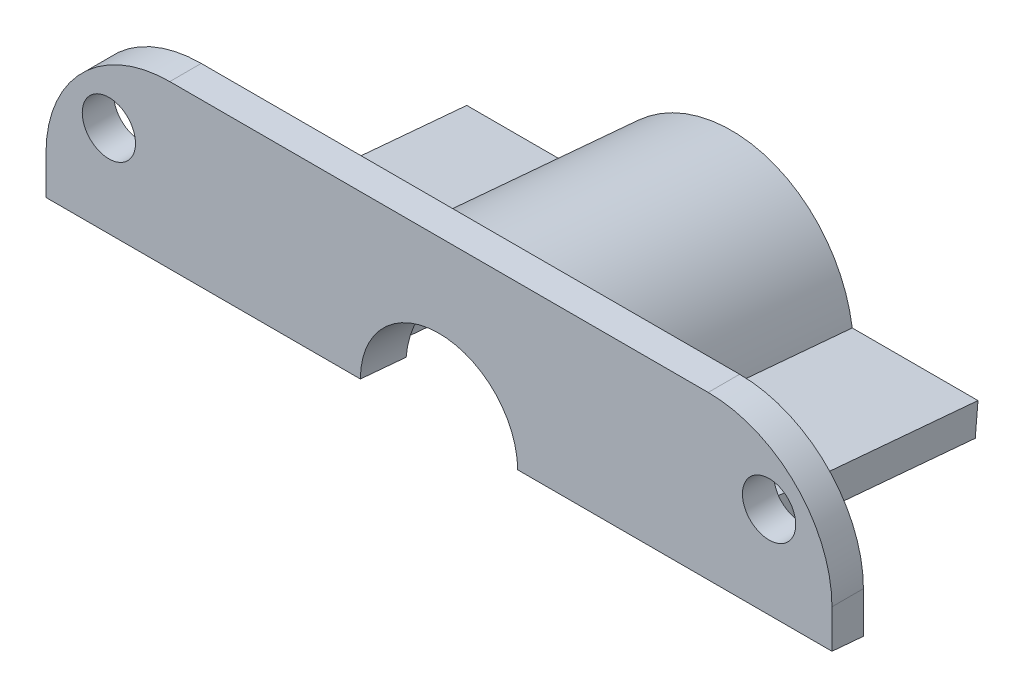
ISO-10303-21;
HEADER;
FILE_DESCRIPTION(('STEP AP214'),'2;1');
FILE_NAME('part.step','',(''),(''),'','','');
FILE_SCHEMA(('AUTOMOTIVE_DESIGN { 1 0 10303 214 1 1 1 1 }'));
ENDSEC;
DATA;
#1=APPLICATION_CONTEXT('core data for automotive mechanical design processes');
#2=APPLICATION_PROTOCOL_DEFINITION('international standard','automotive_design',2000,#1);
#3=PRODUCT_CONTEXT('',#1,'mechanical');
#4=PRODUCT('Part','Part','',(#3));
#5=PRODUCT_RELATED_PRODUCT_CATEGORY('part','',(#4));
#6=PRODUCT_DEFINITION_FORMATION('','',#4);
#7=PRODUCT_DEFINITION_CONTEXT('part definition',#1,'design');
#8=PRODUCT_DEFINITION('design','',#6,#7);
#9=PRODUCT_DEFINITION_SHAPE('','',#8);
#10=(LENGTH_UNIT() NAMED_UNIT(*) SI_UNIT(.MILLI.,.METRE.));
#11=(NAMED_UNIT(*) PLANE_ANGLE_UNIT() SI_UNIT($,.RADIAN.));
#12=(NAMED_UNIT(*) SI_UNIT($,.STERADIAN.) SOLID_ANGLE_UNIT());
#13=UNCERTAINTY_MEASURE_WITH_UNIT(LENGTH_MEASURE(1.E-05),#10,'distance_accuracy_value','');
#14=(GEOMETRIC_REPRESENTATION_CONTEXT(3) GLOBAL_UNCERTAINTY_ASSIGNED_CONTEXT((#13)) GLOBAL_UNIT_ASSIGNED_CONTEXT((#10,
#11,#12)) REPRESENTATION_CONTEXT('',''));
#15=CARTESIAN_POINT('',(0.,0.,0.));
#16=DIRECTION('',(0.,0.,1.));
#17=DIRECTION('',(1.,0.,0.));
#18=AXIS2_PLACEMENT_3D('',#15,#16,#17);
#19=CARTESIAN_POINT('',(0.,3.94962780103435,-0.34554765773733));
#20=DIRECTION('',(0.,0.996194698091746,-0.0871557427476584));
#21=DIRECTION('',(0.,0.0871557427476584,0.996194698091746));
#22=AXIS2_PLACEMENT_3D('',#19,#20,#21);
#23=PLANE('',#22);
#24=CARTESIAN_POINT('',(15.57192189258,-0.423383318951028,-50.329293479727));
#25=DIRECTION('',(0.,0.996194698091746,-0.0871557427476584));
#26=DIRECTION('',(0.,0.0871557427476584,0.996194698091746));
#27=AXIS2_PLACEMENT_3D('',#24,#25,#26);
#28=CIRCLE('',#27,2.15265);
#29=CARTESIAN_POINT('',(15.57192189258,-0.235767509325281,-48.1848349628798));
#30=VERTEX_POINT('',#29);
#31=EDGE_CURVE('E299',#30,#30,#28,.F.);
#32=ORIENTED_EDGE('',*,*,#31,.F.);
#33=EDGE_LOOP('',(#32));
#34=FACE_BOUND('',#33,.T.);
#35=DIRECTION('',(1.,0.,0.));
#36=VECTOR('',#35,1.);
#37=CARTESIAN_POINT('',(0.,0.222221205355855,-42.95));
#38=LINE('',#37,#36);
#39=CARTESIAN_POINT('',(6.35,0.222221205355858,-42.95));
#40=VERTEX_POINT('',#39);
#41=CARTESIAN_POINT('',(31.75,0.222221205355855,-42.95));
#42=VERTEX_POINT('',#41);
#43=EDGE_CURVE('E168',#40,#42,#38,.T.);
#44=ORIENTED_EDGE('',*,*,#43,.F.);
#45=DIRECTION('',(0.,-0.0871557427476584,-0.996194698091745));
#46=VECTOR('',#45,1.);
#47=CARTESIAN_POINT('',(6.35,0.321921912640443,-41.8104157011149));
#48=LINE('',#47,#46);
#49=CARTESIAN_POINT('',(6.35,-0.101294306791094,-46.6477992245943));
#50=VERTEX_POINT('',#49);
#51=EDGE_CURVE('E62',#50,#40,#48,.F.);
#52=ORIENTED_EDGE('',*,*,#51,.F.);
#53=DIRECTION('',(1.,0.,0.));
#54=VECTOR('',#53,1.);
#55=CARTESIAN_POINT('',(0.,-0.101294306791096,-46.6477992245943));
#56=LINE('',#55,#54);
#57=CARTESIAN_POINT('',(7.874,-0.101294306791093,-46.6477992245943));
#58=VERTEX_POINT('',#57);
#59=EDGE_CURVE('E54',#50,#58,#56,.T.);
#60=ORIENTED_EDGE('',*,*,#59,.T.);
#61=DIRECTION('',(0.,0.0871557427476584,0.996194698091746));
#62=VECTOR('',#61,1.);
#63=CARTESIAN_POINT('',(7.874,-1.76161120613399,-65.625308223242));
#64=LINE('',#63,#62);
#65=CARTESIAN_POINT('',(7.874,-1.76161120613399,-65.625308223242));
#66=VERTEX_POINT('',#65);
#67=EDGE_CURVE('E185',#58,#66,#64,.F.);
#68=ORIENTED_EDGE('',*,*,#67,.T.);
#69=DIRECTION('',(1.,0.,0.));
#70=VECTOR('',#69,1.);
#71=CARTESIAN_POINT('',(0.,-1.76161120613399,-65.625308223242));
#72=LINE('',#71,#70);
#73=CARTESIAN_POINT('',(20.65192189258,-1.76161120613399,-65.625308223242));
#74=VERTEX_POINT('',#73);
#75=EDGE_CURVE('E176',#66,#74,#72,.T.);
#76=ORIENTED_EDGE('',*,*,#75,.T.);
#77=DIRECTION('',(0.,-0.0871557427476584,-0.996194698091746));
#78=VECTOR('',#77,1.);
#79=CARTESIAN_POINT('',(20.65192189258,0.322001803913616,-41.8095025396841));
#80=LINE('',#79,#78);
#81=CARTESIAN_POINT('',(20.65192189258,0.,-45.49));
#82=VERTEX_POINT('',#81);
#83=EDGE_CURVE('E193',#82,#74,#80,.T.);
#84=ORIENTED_EDGE('',*,*,#83,.F.);
#85=DIRECTION('',(1.,0.,0.));
#86=VECTOR('',#85,1.);
#87=CARTESIAN_POINT('',(0.,0.,-45.49));
#88=LINE('',#87,#86);
#89=CARTESIAN_POINT('',(31.75,0.,-45.49));
#90=VERTEX_POINT('',#89);
#91=EDGE_CURVE('E191',#82,#90,#88,.T.);
#92=ORIENTED_EDGE('',*,*,#91,.T.);
#93=DIRECTION('',(0.,-0.0871557427476584,-0.996194698091746));
#94=VECTOR('',#93,1.);
#95=CARTESIAN_POINT('',(31.75,0.,-45.49));
#96=LINE('',#95,#94);
#97=EDGE_CURVE('E206',#42,#90,#96,.T.);
#98=ORIENTED_EDGE('',*,*,#97,.F.);
#99=EDGE_LOOP('',(#44,#52,#60,#68,#76,#84,#92,#98));
#100=FACE_BOUND('',#99,.T.);
#101=ADVANCED_FACE('F44',(#34,#100),#23,.F.);
#102=CARTESIAN_POINT('',(-15.57192189258,-0.423383318951039,-50.329293479727));
#103=DIRECTION('',(0.,0.996194698091746,-0.0871557427476584));
#104=DIRECTION('',(0.,0.0871557427476584,0.996194698091746));
#105=AXIS2_PLACEMENT_3D('',#102,#103,#104);
#106=CIRCLE('',#105,2.15265);
#107=CARTESIAN_POINT('',(-15.57192189258,-0.235767509325292,-48.1848349628798));
#108=VERTEX_POINT('',#107);
#109=EDGE_CURVE('E183',#108,#108,#106,.F.);
#110=ORIENTED_EDGE('',*,*,#109,.F.);
#111=EDGE_LOOP('',(#110));
#112=FACE_BOUND('',#111,.T.);
#113=CARTESIAN_POINT('',(-7.874,-0.101294306791099,-46.6477992245943));
#114=VERTEX_POINT('',#113);
#115=CARTESIAN_POINT('',(-6.35,-0.1012943067911,-46.6477992245943));
#116=VERTEX_POINT('',#115);
#117=EDGE_CURVE('E11',#114,#116,#56,.T.);
#118=ORIENTED_EDGE('',*,*,#117,.T.);
#119=DIRECTION('',(0.,-0.0871557427476584,-0.996194698091745));
#120=VECTOR('',#119,1.);
#121=CARTESIAN_POINT('',(-6.35,0.321921912640439,-41.8104157011149));
#122=LINE('',#121,#120);
#123=CARTESIAN_POINT('',(-6.35,0.222221205355853,-42.95));
#124=VERTEX_POINT('',#123);
#125=EDGE_CURVE('E161',#124,#116,#122,.T.);
#126=ORIENTED_EDGE('',*,*,#125,.F.);
#127=CARTESIAN_POINT('',(-31.75,0.222221205355855,-42.95));
#128=VERTEX_POINT('',#127);
#129=EDGE_CURVE('E48',#128,#124,#38,.T.);
#130=ORIENTED_EDGE('',*,*,#129,.F.);
#131=DIRECTION('',(0.,0.0871557427476584,0.996194698091746));
#132=VECTOR('',#131,1.);
#133=CARTESIAN_POINT('',(-31.75,0.,-45.49));
#134=LINE('',#133,#132);
#135=CARTESIAN_POINT('',(-31.75,0.,-45.49));
#136=VERTEX_POINT('',#135);
#137=EDGE_CURVE('E203',#136,#128,#134,.T.);
#138=ORIENTED_EDGE('',*,*,#137,.F.);
#139=CARTESIAN_POINT('',(-20.65192189258,0.,-45.49));
#140=VERTEX_POINT('',#139);
#141=EDGE_CURVE('E202',#136,#140,#88,.T.);
#142=ORIENTED_EDGE('',*,*,#141,.T.);
#143=DIRECTION('',(0.,0.0871557427476584,0.996194698091746));
#144=VECTOR('',#143,1.);
#145=CARTESIAN_POINT('',(-20.65192189258,0.322001803913602,-41.8095025396841));
#146=LINE('',#145,#144);
#147=CARTESIAN_POINT('',(-20.65192189258,-1.76161120613399,-65.625308223242));
#148=VERTEX_POINT('',#147);
#149=EDGE_CURVE('E196',#148,#140,#146,.T.);
#150=ORIENTED_EDGE('',*,*,#149,.F.);
#151=CARTESIAN_POINT('',(-7.874,-1.76161120613399,-65.625308223242));
#152=VERTEX_POINT('',#151);
#153=EDGE_CURVE('E179',#148,#152,#72,.T.);
#154=ORIENTED_EDGE('',*,*,#153,.T.);
#155=DIRECTION('',(0.,0.0871557427476584,0.996194698091746));
#156=VECTOR('',#155,1.);
#157=CARTESIAN_POINT('',(-7.874,-1.76161120613399,-65.625308223242));
#158=LINE('',#157,#156);
#159=EDGE_CURVE('E188',#152,#114,#158,.T.);
#160=ORIENTED_EDGE('',*,*,#159,.T.);
#161=EDGE_LOOP('',(#118,#126,#130,#138,#142,#150,#154,#160));
#162=FACE_BOUND('',#161,.T.);
#163=ADVANCED_FACE('F46',(#112,#162),#23,.F.);
#164=CARTESIAN_POINT('',(0.,0.,-45.49));
#165=DIRECTION('',(0.,0.,-1.));
#166=DIRECTION('',(-1.,0.,0.));
#167=AXIS2_PLACEMENT_3D('',#164,#165,#166);
#168=PLANE('',#167);
#169=ORIENTED_EDGE('',*,*,#141,.F.);
#170=DIRECTION('',(0.,1.,0.));
#171=VECTOR('',#170,1.);
#172=CARTESIAN_POINT('',(-31.75,0.,-45.49));
#173=LINE('',#172,#171);
#174=CARTESIAN_POINT('',(-31.75,3.335,-45.49));
#175=VERTEX_POINT('',#174);
#176=EDGE_CURVE('E370',#136,#175,#173,.T.);
#177=ORIENTED_EDGE('',*,*,#176,.T.);
#178=CARTESIAN_POINT('',(-21.75,3.335,-45.49));
#179=DIRECTION('',(0.,0.,-1.));
#180=DIRECTION('',(-1.,0.,0.));
#181=AXIS2_PLACEMENT_3D('',#178,#179,#180);
#182=CIRCLE('',#181,10.);
#183=CARTESIAN_POINT('',(-21.75,13.335,-45.49));
#184=VERTEX_POINT('',#183);
#185=EDGE_CURVE('E290',#175,#184,#182,.T.);
#186=ORIENTED_EDGE('',*,*,#185,.T.);
#187=DIRECTION('',(-1.,0.,0.));
#188=VECTOR('',#187,1.);
#189=CARTESIAN_POINT('',(0.,13.335,-45.49));
#190=LINE('',#189,#188);
#191=CARTESIAN_POINT('',(21.75,13.335,-45.49));
#192=VERTEX_POINT('',#191);
#193=EDGE_CURVE('E271',#192,#184,#190,.T.);
#194=ORIENTED_EDGE('',*,*,#193,.F.);
#195=CARTESIAN_POINT('',(21.75,3.335,-45.49));
#196=DIRECTION('',(0.,0.,-1.));
#197=DIRECTION('',(-1.,0.,0.));
#198=AXIS2_PLACEMENT_3D('',#195,#196,#197);
#199=CIRCLE('',#198,10.);
#200=CARTESIAN_POINT('',(31.75,3.335,-45.49));
#201=VERTEX_POINT('',#200);
#202=EDGE_CURVE('E293',#192,#201,#199,.T.);
#203=ORIENTED_EDGE('',*,*,#202,.T.);
#204=DIRECTION('',(0.,-1.,0.));
#205=VECTOR('',#204,1.);
#206=CARTESIAN_POINT('',(31.75,0.,-45.49));
#207=LINE('',#206,#205);
#208=EDGE_CURVE('E274',#201,#90,#207,.T.);
#209=ORIENTED_EDGE('',*,*,#208,.T.);
#210=ORIENTED_EDGE('',*,*,#91,.F.);
#211=DIRECTION('',(0.,-1.,0.));
#212=VECTOR('',#211,1.);
#213=CARTESIAN_POINT('',(20.65192189258,-3.62762599712074,-45.49));
#214=LINE('',#213,#212);
#215=CARTESIAN_POINT('',(20.65192189258,2.5497023873601,-45.49));
#216=VERTEX_POINT('',#215);
#217=EDGE_CURVE('E244',#216,#82,#214,.T.);
#218=ORIENTED_EDGE('',*,*,#217,.F.);
#219=DIRECTION('',(1.,0.,0.));
#220=VECTOR('',#219,1.);
#221=CARTESIAN_POINT('',(0.,2.5497023873601,-45.49));
#222=LINE('',#221,#220);
#223=CARTESIAN_POINT('',(10.49192189258,2.5497023873601,-45.49));
#224=VERTEX_POINT('',#223);
#225=EDGE_CURVE('E234',#224,#216,#222,.T.);
#226=ORIENTED_EDGE('',*,*,#225,.F.);
#227=CARTESIAN_POINT('',(0.,0.,-45.49));
#228=DIRECTION('',(0.,0.,-1.));
#229=DIRECTION('',(0.,-1.,0.));
#230=AXIS2_PLACEMENT_3D('',#227,#228,#229);
#231=ELLIPSE('',#230,10.8362351462804,10.795);
#232=CARTESIAN_POINT('',(-10.49192189258,2.54970238736011,-45.49));
#233=VERTEX_POINT('',#232);
#234=EDGE_CURVE('E230',#224,#233,#231,.F.);
#235=ORIENTED_EDGE('',*,*,#234,.T.);
#236=DIRECTION('',(1.,0.,0.));
#237=VECTOR('',#236,1.);
#238=CARTESIAN_POINT('',(0.,2.54970238736011,-45.49));
#239=LINE('',#238,#237);
#240=CARTESIAN_POINT('',(-20.65192189258,2.5497023873601,-45.49));
#241=VERTEX_POINT('',#240);
#242=EDGE_CURVE('E226',#241,#233,#239,.T.);
#243=ORIENTED_EDGE('',*,*,#242,.F.);
#244=DIRECTION('',(0.,1.,0.));
#245=VECTOR('',#244,1.);
#246=CARTESIAN_POINT('',(-20.65192189258,-3.62762599712074,-45.49));
#247=LINE('',#246,#245);
#248=EDGE_CURVE('E222',#140,#241,#247,.T.);
#249=ORIENTED_EDGE('',*,*,#248,.F.);
#250=EDGE_LOOP('',(#169,#177,#186,#194,#203,#209,#210,#218,#226,#235,#243,#249));
#251=FACE_BOUND('',#250,.T.);
#252=CARTESIAN_POINT('',(-26.67,7.62,-45.49));
#253=DIRECTION('',(0.,0.,-1.));
#254=DIRECTION('',(-1.,0.,0.));
#255=AXIS2_PLACEMENT_3D('',#252,#253,#254);
#256=CIRCLE('',#255,2.15265);
#257=CARTESIAN_POINT('',(-28.82265,7.62,-45.49));
#258=VERTEX_POINT('',#257);
#259=EDGE_CURVE('E262',#258,#258,#256,.T.);
#260=ORIENTED_EDGE('',*,*,#259,.F.);
#261=EDGE_LOOP('',(#260));
#262=FACE_BOUND('',#261,.T.);
#263=CARTESIAN_POINT('',(26.67,7.62,-45.49));
#264=DIRECTION('',(0.,0.,-1.));
#265=DIRECTION('',(-1.,0.,0.));
#266=AXIS2_PLACEMENT_3D('',#263,#264,#265);
#267=CIRCLE('',#266,2.15265);
#268=CARTESIAN_POINT('',(24.51735,7.62,-45.49));
#269=VERTEX_POINT('',#268);
#270=EDGE_CURVE('E266',#269,#269,#267,.T.);
#271=ORIENTED_EDGE('',*,*,#270,.F.);
#272=EDGE_LOOP('',(#271));
#273=FACE_BOUND('',#272,.T.);
#274=ADVANCED_FACE('F223',(#251,#262,#273),#168,.T.);
#275=CARTESIAN_POINT('',(0.,-1.761611206134,-65.625308223242));
#276=DIRECTION('',(0.,0.0871557427476584,0.996194698091746));
#277=DIRECTION('',(0.,-0.996194698091746,0.0871557427476584));
#278=AXIS2_PLACEMENT_3D('',#275,#276,#277);
#279=CYLINDRICAL_SURFACE('',#278,7.874);
#280=ORIENTED_EDGE('',*,*,#159,.F.);
#281=CARTESIAN_POINT('',(0.,-1.761611206134,-65.625308223242));
#282=DIRECTION('',(0.,-0.0871557427476584,-0.996194698091746));
#283=DIRECTION('',(0.,0.996194698091746,-0.0871557427476584));
#284=AXIS2_PLACEMENT_3D('',#281,#282,#283);
#285=CIRCLE('',#284,7.874);
#286=EDGE_CURVE('E236',#152,#66,#285,.T.);
#287=ORIENTED_EDGE('',*,*,#286,.T.);
#288=ORIENTED_EDGE('',*,*,#67,.F.);
#289=CARTESIAN_POINT('',(0.,-0.101294306791106,-46.6477992245943));
#290=DIRECTION('',(0.,-0.0871557427476584,-0.996194698091746));
#291=DIRECTION('',(0.,0.996194698091746,-0.0871557427476584));
#292=AXIS2_PLACEMENT_3D('',#289,#290,#291);
#293=CIRCLE('',#292,7.874);
#294=EDGE_CURVE('E174',#114,#58,#293,.T.);
#295=ORIENTED_EDGE('',*,*,#294,.F.);
#296=EDGE_LOOP('',(#280,#287,#288,#295));
#297=FACE_BOUND('',#296,.T.);
#298=ADVANCED_FACE('F318',(#297),#279,.F.);
#299=CARTESIAN_POINT('',(0.,-4.05092210782545,-46.3022515668569));
#300=DIRECTION('',(0.,-0.0871557427476584,-0.996194698091746));
#301=DIRECTION('',(0.,0.996194698091746,-0.0871557427476584));
#302=AXIS2_PLACEMENT_3D('',#299,#300,#301);
#303=PLANE('',#302);
#304=CARTESIAN_POINT('',(0.,-0.101294306791095,-46.6477992245943));
#305=DIRECTION('',(0.,-0.0871557427476584,-0.996194698091746));
#306=DIRECTION('',(0.,0.996194698091746,-0.0871557427476584));
#307=AXIS2_PLACEMENT_3D('',#304,#305,#306);
#308=CIRCLE('',#307,6.35);
#309=EDGE_CURVE('E158',#116,#50,#308,.T.);
#310=ORIENTED_EDGE('',*,*,#309,.F.);
#311=ORIENTED_EDGE('',*,*,#117,.F.);
#312=ORIENTED_EDGE('',*,*,#294,.T.);
#313=ORIENTED_EDGE('',*,*,#59,.F.);
#314=EDGE_LOOP('',(#310,#311,#312,#313));
#315=FACE_BOUND('',#314,.T.);
#316=ADVANCED_FACE('F172',(#315),#303,.T.);
#317=CARTESIAN_POINT('',(20.65192189258,-3.62762599712074,-41.4639548819467));
#318=DIRECTION('',(-1.,0.,0.));
#319=DIRECTION('',(0.,0.,1.));
#320=AXIS2_PLACEMENT_3D('',#317,#318,#319);
#321=PLANE('',#320);
#322=ORIENTED_EDGE('',*,*,#217,.T.);
#323=ORIENTED_EDGE('',*,*,#83,.T.);
#324=DIRECTION('',(0.,0.996194698091746,-0.0871557427476584));
#325=VECTOR('',#324,1.);
#326=CARTESIAN_POINT('',(20.65192189258,-5.71123900716834,-65.2797605655047));
#327=LINE('',#326,#325);
#328=CARTESIAN_POINT('',(20.65192189258,0.768723327019037,-65.8466838098211));
#329=VERTEX_POINT('',#328);
#330=EDGE_CURVE('E436',#74,#329,#327,.T.);
#331=ORIENTED_EDGE('',*,*,#330,.T.);
#332=DIRECTION('',(0.,-0.0871557427476584,-0.996194698091746));
#333=VECTOR('',#332,1.);
#334=CARTESIAN_POINT('',(20.65192189258,2.85233633706663,-42.0308781262631));
#335=LINE('',#334,#333);
#336=EDGE_CURVE('E257',#216,#329,#335,.T.);
#337=ORIENTED_EDGE('',*,*,#336,.F.);
#338=EDGE_LOOP('',(#322,#323,#331,#337));
#339=FACE_BOUND('',#338,.T.);
#340=ADVANCED_FACE('F448',(#339),#321,.F.);
#341=CARTESIAN_POINT('',(0.,2.85233633706663,-42.0308781262631));
#342=DIRECTION('',(0.,-0.996194698091746,0.0871557427476584));
#343=DIRECTION('',(0.,-0.0871557427476584,-0.996194698091746));
#344=AXIS2_PLACEMENT_3D('',#341,#342,#343);
#345=PLANE('',#344);
#346=CARTESIAN_POINT('',(15.57192189258,2.10695121420201,-50.5506690663061));
#347=DIRECTION('',(0.,0.996194698091746,-0.0871557427476584));
#348=DIRECTION('',(0.,0.0871557427476584,0.996194698091746));
#349=AXIS2_PLACEMENT_3D('',#346,#347,#348);
#350=CIRCLE('',#349,2.15265);
#351=CARTESIAN_POINT('',(15.57192189258,2.29456702382776,-48.4062105494589));
#352=VERTEX_POINT('',#351);
#353=EDGE_CURVE('E413',#352,#352,#350,.T.);
#354=ORIENTED_EDGE('',*,*,#353,.F.);
#355=EDGE_LOOP('',(#354));
#356=FACE_BOUND('',#355,.T.);
#357=DIRECTION('',(0.,-0.0871557427476584,-0.996194698091746));
#358=VECTOR('',#357,1.);
#359=CARTESIAN_POINT('',(10.49192189258,2.85233633706663,-42.0308781262631));
#360=LINE('',#359,#358);
#361=CARTESIAN_POINT('',(10.49192189258,0.768723327019037,-65.8466838098211));
#362=VERTEX_POINT('',#361);
#363=EDGE_CURVE('E254',#224,#362,#360,.T.);
#364=ORIENTED_EDGE('',*,*,#363,.F.);
#365=ORIENTED_EDGE('',*,*,#225,.T.);
#366=ORIENTED_EDGE('',*,*,#336,.T.);
#367=DIRECTION('',(-1.,0.,0.));
#368=VECTOR('',#367,1.);
#369=CARTESIAN_POINT('',(0.,0.768723327019037,-65.8466838098211));
#370=LINE('',#369,#368);
#371=EDGE_CURVE('E432',#329,#362,#370,.T.);
#372=ORIENTED_EDGE('',*,*,#371,.T.);
#373=EDGE_LOOP('',(#364,#365,#366,#372));
#374=FACE_BOUND('',#373,.T.);
#375=ADVANCED_FACE('F452',(#356,#374),#345,.F.);
#376=CARTESIAN_POINT('',(15.57192189258,-16.8705577844457,-48.8903521669632));
#377=DIRECTION('',(0.,0.996194698091746,-0.0871557427476584));
#378=DIRECTION('',(0.,0.0871557427476584,0.996194698091746));
#379=AXIS2_PLACEMENT_3D('',#376,#377,#378);
#380=CYLINDRICAL_SURFACE('',#379,2.15265);
#381=ORIENTED_EDGE('',*,*,#31,.T.);
#382=EDGE_LOOP('',(#381));
#383=FACE_BOUND('',#382,.T.);
#384=ORIENTED_EDGE('',*,*,#353,.T.);
#385=EDGE_LOOP('',(#384));
#386=FACE_BOUND('',#385,.T.);
#387=ADVANCED_FACE('F474',(#383,#386),#380,.F.);
#388=CARTESIAN_POINT('',(0.,0.322001803913599,-41.8095025396841));
#389=DIRECTION('',(0.,-0.0871557427476584,-0.996194698091746));
#390=DIRECTION('',(0.,0.996194698091746,-0.0871557427476584));
#391=AXIS2_PLACEMENT_3D('',#388,#389,#390);
#392=CYLINDRICAL_SURFACE('',#391,10.795);
#393=ORIENTED_EDGE('',*,*,#234,.F.);
#394=ORIENTED_EDGE('',*,*,#363,.T.);
#395=CARTESIAN_POINT('',(0.,-1.761611206134,-65.625308223242));
#396=DIRECTION('',(0.,-0.0871557427476584,-0.996194698091746));
#397=DIRECTION('',(0.,0.996194698091746,-0.0871557427476584));
#398=AXIS2_PLACEMENT_3D('',#395,#396,#397);
#399=CIRCLE('',#398,10.795);
#400=CARTESIAN_POINT('',(-10.49192189258,0.768723327019041,-65.8466838098211));
#401=VERTEX_POINT('',#400);
#402=EDGE_CURVE('E428',#401,#362,#399,.T.);
#403=ORIENTED_EDGE('',*,*,#402,.F.);
#404=DIRECTION('',(0.,-0.0871557427476584,-0.996194698091746));
#405=VECTOR('',#404,1.);
#406=CARTESIAN_POINT('',(-10.49192189258,2.85233633706664,-42.0308781262631));
#407=LINE('',#406,#405);
#408=EDGE_CURVE('E251',#233,#401,#407,.T.);
#409=ORIENTED_EDGE('',*,*,#408,.F.);
#410=EDGE_LOOP('',(#393,#394,#403,#409));
#411=FACE_BOUND('',#410,.T.);
#412=ADVANCED_FACE('F455',(#411),#392,.T.);
#413=CARTESIAN_POINT('',(0.,2.85233633706664,-42.0308781262631));
#414=DIRECTION('',(0.,-0.996194698091746,0.0871557427476584));
#415=DIRECTION('',(0.,-0.0871557427476584,-0.996194698091746));
#416=AXIS2_PLACEMENT_3D('',#413,#414,#415);
#417=PLANE('',#416);
#418=CARTESIAN_POINT('',(-15.57192189258,2.106951214202,-50.5506690663061));
#419=DIRECTION('',(0.,0.996194698091746,-0.0871557427476584));
#420=DIRECTION('',(0.,0.0871557427476584,0.996194698091746));
#421=AXIS2_PLACEMENT_3D('',#418,#419,#420);
#422=CIRCLE('',#421,2.15265);
#423=CARTESIAN_POINT('',(-15.57192189258,2.29456702382775,-48.4062105494589));
#424=VERTEX_POINT('',#423);
#425=EDGE_CURVE('E414',#424,#424,#422,.T.);
#426=ORIENTED_EDGE('',*,*,#425,.F.);
#427=EDGE_LOOP('',(#426));
#428=FACE_BOUND('',#427,.T.);
#429=DIRECTION('',(0.,-0.0871557427476584,-0.996194698091746));
#430=VECTOR('',#429,1.);
#431=CARTESIAN_POINT('',(-20.65192189258,2.85233633706663,-42.0308781262631));
#432=LINE('',#431,#430);
#433=CARTESIAN_POINT('',(-20.65192189258,0.768723327019037,-65.8466838098211));
#434=VERTEX_POINT('',#433);
#435=EDGE_CURVE('E248',#241,#434,#432,.T.);
#436=ORIENTED_EDGE('',*,*,#435,.F.);
#437=ORIENTED_EDGE('',*,*,#242,.T.);
#438=ORIENTED_EDGE('',*,*,#408,.T.);
#439=DIRECTION('',(-1.,0.,0.));
#440=VECTOR('',#439,1.);
#441=CARTESIAN_POINT('',(0.,0.768723327019044,-65.8466838098211));
#442=LINE('',#441,#440);
#443=EDGE_CURVE('E424',#401,#434,#442,.T.);
#444=ORIENTED_EDGE('',*,*,#443,.T.);
#445=EDGE_LOOP('',(#436,#437,#438,#444));
#446=FACE_BOUND('',#445,.T.);
#447=ADVANCED_FACE('F459',(#428,#446),#417,.F.);
#448=CARTESIAN_POINT('',(-15.57192189258,-16.8705577844458,-48.8903521669632));
#449=DIRECTION('',(0.,0.996194698091746,-0.0871557427476584));
#450=DIRECTION('',(0.,0.0871557427476584,0.996194698091746));
#451=AXIS2_PLACEMENT_3D('',#448,#449,#450);
#452=CYLINDRICAL_SURFACE('',#451,2.15265);
#453=ORIENTED_EDGE('',*,*,#109,.T.);
#454=EDGE_LOOP('',(#453));
#455=FACE_BOUND('',#454,.T.);
#456=ORIENTED_EDGE('',*,*,#425,.T.);
#457=EDGE_LOOP('',(#456));
#458=FACE_BOUND('',#457,.T.);
#459=ADVANCED_FACE('F308',(#455,#458),#452,.F.);
#460=CARTESIAN_POINT('',(-20.65192189258,-3.62762599712074,-41.4639548819467));
#461=DIRECTION('',(1.,0.,0.));
#462=DIRECTION('',(0.,0.,-1.));
#463=AXIS2_PLACEMENT_3D('',#460,#461,#462);
#464=PLANE('',#463);
#465=DIRECTION('',(0.,-0.996194698091746,0.0871557427476584));
#466=VECTOR('',#465,1.);
#467=CARTESIAN_POINT('',(-20.65192189258,-5.71123900716834,-65.2797605655047));
#468=LINE('',#467,#466);
#469=EDGE_CURVE('E421',#434,#148,#468,.T.);
#470=ORIENTED_EDGE('',*,*,#469,.T.);
#471=ORIENTED_EDGE('',*,*,#149,.T.);
#472=ORIENTED_EDGE('',*,*,#248,.T.);
#473=ORIENTED_EDGE('',*,*,#435,.T.);
#474=EDGE_LOOP('',(#470,#471,#472,#473));
#475=FACE_BOUND('',#474,.T.);
#476=ADVANCED_FACE('F362',(#475),#464,.F.);
#477=CARTESIAN_POINT('',(0.,-5.71123900716834,-65.2797605655047));
#478=DIRECTION('',(0.,-0.0871557427476584,-0.996194698091746));
#479=DIRECTION('',(0.,0.996194698091746,-0.0871557427476584));
#480=AXIS2_PLACEMENT_3D('',#477,#478,#479);
#481=PLANE('',#480);
#482=ORIENTED_EDGE('',*,*,#153,.F.);
#483=ORIENTED_EDGE('',*,*,#469,.F.);
#484=ORIENTED_EDGE('',*,*,#443,.F.);
#485=ORIENTED_EDGE('',*,*,#402,.T.);
#486=ORIENTED_EDGE('',*,*,#371,.F.);
#487=ORIENTED_EDGE('',*,*,#330,.F.);
#488=ORIENTED_EDGE('',*,*,#75,.F.);
#489=ORIENTED_EDGE('',*,*,#286,.F.);
#490=EDGE_LOOP('',(#482,#483,#484,#485,#486,#487,#488,#489));
#491=FACE_BOUND('',#490,.T.);
#492=ADVANCED_FACE('F357',(#491),#481,.T.);
#493=CARTESIAN_POINT('',(-21.75,3.335,-45.49));
#494=DIRECTION('',(0.,0.,-1.));
#495=DIRECTION('',(-1.,0.,0.));
#496=AXIS2_PLACEMENT_3D('',#493,#494,#495);
#497=CYLINDRICAL_SURFACE('',#496,10.);
#498=ORIENTED_EDGE('',*,*,#185,.F.);
#499=DIRECTION('',(0.,0.,1.));
#500=VECTOR('',#499,1.);
#501=CARTESIAN_POINT('',(-31.75,3.335,-45.49));
#502=LINE('',#501,#500);
#503=CARTESIAN_POINT('',(-31.75,3.335,-42.95));
#504=VERTEX_POINT('',#503);
#505=EDGE_CURVE('E296',#504,#175,#502,.F.);
#506=ORIENTED_EDGE('',*,*,#505,.F.);
#507=CARTESIAN_POINT('',(-21.75,3.335,-42.95));
#508=DIRECTION('',(0.,0.,-1.));
#509=DIRECTION('',(-1.,0.,0.));
#510=AXIS2_PLACEMENT_3D('',#507,#508,#509);
#511=CIRCLE('',#510,10.);
#512=CARTESIAN_POINT('',(-21.75,13.335,-42.95));
#513=VERTEX_POINT('',#512);
#514=EDGE_CURVE('E383',#513,#504,#511,.F.);
#515=ORIENTED_EDGE('',*,*,#514,.F.);
#516=DIRECTION('',(0.,0.,1.));
#517=VECTOR('',#516,1.);
#518=CARTESIAN_POINT('',(-21.75,13.335,-42.95));
#519=LINE('',#518,#517);
#520=EDGE_CURVE('E283',#184,#513,#519,.T.);
#521=ORIENTED_EDGE('',*,*,#520,.F.);
#522=EDGE_LOOP('',(#498,#506,#515,#521));
#523=FACE_BOUND('',#522,.T.);
#524=ADVANCED_FACE('F349',(#523),#497,.T.);
#525=CARTESIAN_POINT('',(0.,13.335,-45.49));
#526=DIRECTION('',(0.,1.,0.));
#527=DIRECTION('',(0.,0.,1.));
#528=AXIS2_PLACEMENT_3D('',#525,#526,#527);
#529=PLANE('',#528);
#530=DIRECTION('',(-1.,0.,0.));
#531=VECTOR('',#530,1.);
#532=CARTESIAN_POINT('',(0.,13.335,-42.95));
#533=LINE('',#532,#531);
#534=CARTESIAN_POINT('',(21.75,13.335,-42.95));
#535=VERTEX_POINT('',#534);
#536=EDGE_CURVE('E374',#535,#513,#533,.T.);
#537=ORIENTED_EDGE('',*,*,#536,.F.);
#538=DIRECTION('',(0.,0.,1.));
#539=VECTOR('',#538,1.);
#540=CARTESIAN_POINT('',(21.75,13.335,-45.49));
#541=LINE('',#540,#539);
#542=EDGE_CURVE('E287',#535,#192,#541,.F.);
#543=ORIENTED_EDGE('',*,*,#542,.T.);
#544=ORIENTED_EDGE('',*,*,#193,.T.);
#545=ORIENTED_EDGE('',*,*,#520,.T.);
#546=EDGE_LOOP('',(#537,#543,#544,#545));
#547=FACE_BOUND('',#546,.T.);
#548=ADVANCED_FACE('F346',(#547),#529,.T.);
#549=CARTESIAN_POINT('',(21.75,3.335,-45.49));
#550=DIRECTION('',(0.,0.,-1.));
#551=DIRECTION('',(-1.,0.,0.));
#552=AXIS2_PLACEMENT_3D('',#549,#550,#551);
#553=CYLINDRICAL_SURFACE('',#552,10.);
#554=ORIENTED_EDGE('',*,*,#202,.F.);
#555=ORIENTED_EDGE('',*,*,#542,.F.);
#556=CARTESIAN_POINT('',(21.75,3.335,-42.95));
#557=DIRECTION('',(0.,0.,-1.));
#558=DIRECTION('',(-1.,0.,0.));
#559=AXIS2_PLACEMENT_3D('',#556,#557,#558);
#560=CIRCLE('',#559,10.);
#561=CARTESIAN_POINT('',(31.75,3.335,-42.95));
#562=VERTEX_POINT('',#561);
#563=EDGE_CURVE('E281',#562,#535,#560,.F.);
#564=ORIENTED_EDGE('',*,*,#563,.F.);
#565=DIRECTION('',(0.,0.,1.));
#566=VECTOR('',#565,1.);
#567=CARTESIAN_POINT('',(31.75,3.335,-42.95));
#568=LINE('',#567,#566);
#569=EDGE_CURVE('E377',#201,#562,#568,.T.);
#570=ORIENTED_EDGE('',*,*,#569,.F.);
#571=EDGE_LOOP('',(#554,#555,#564,#570));
#572=FACE_BOUND('',#571,.T.);
#573=ADVANCED_FACE('F345',(#572),#553,.T.);
#574=CARTESIAN_POINT('',(31.75,0.,-45.49));
#575=DIRECTION('',(-1.,0.,0.));
#576=DIRECTION('',(0.,-1.,0.));
#577=AXIS2_PLACEMENT_3D('',#574,#575,#576);
#578=PLANE('',#577);
#579=DIRECTION('',(0.,-1.,0.));
#580=VECTOR('',#579,1.);
#581=CARTESIAN_POINT('',(31.75,0.,-42.95));
#582=LINE('',#581,#580);
#583=EDGE_CURVE('E394',#562,#42,#582,.T.);
#584=ORIENTED_EDGE('',*,*,#583,.T.);
#585=ORIENTED_EDGE('',*,*,#97,.T.);
#586=ORIENTED_EDGE('',*,*,#208,.F.);
#587=ORIENTED_EDGE('',*,*,#569,.T.);
#588=EDGE_LOOP('',(#584,#585,#586,#587));
#589=FACE_BOUND('',#588,.T.);
#590=ADVANCED_FACE('F341',(#589),#578,.F.);
#591=CARTESIAN_POINT('',(-31.75,0.,-45.49));
#592=DIRECTION('',(1.,0.,0.));
#593=DIRECTION('',(0.,0.,-1.));
#594=AXIS2_PLACEMENT_3D('',#591,#592,#593);
#595=PLANE('',#594);
#596=ORIENTED_EDGE('',*,*,#176,.F.);
#597=ORIENTED_EDGE('',*,*,#137,.T.);
#598=DIRECTION('',(0.,1.,0.));
#599=VECTOR('',#598,1.);
#600=CARTESIAN_POINT('',(-31.75,0.,-42.95));
#601=LINE('',#600,#599);
#602=EDGE_CURVE('E267',#128,#504,#601,.T.);
#603=ORIENTED_EDGE('',*,*,#602,.T.);
#604=ORIENTED_EDGE('',*,*,#505,.T.);
#605=EDGE_LOOP('',(#596,#597,#603,#604));
#606=FACE_BOUND('',#605,.T.);
#607=ADVANCED_FACE('F338',(#606),#595,.F.);
#608=CARTESIAN_POINT('',(26.67,7.62,-45.49));
#609=DIRECTION('',(0.,0.,1.));
#610=DIRECTION('',(1.,0.,0.));
#611=AXIS2_PLACEMENT_3D('',#608,#609,#610);
#612=CYLINDRICAL_SURFACE('',#611,2.15265);
#613=ORIENTED_EDGE('',*,*,#270,.T.);
#614=EDGE_LOOP('',(#613));
#615=FACE_BOUND('',#614,.T.);
#616=CARTESIAN_POINT('',(26.67,7.62,-42.95));
#617=DIRECTION('',(0.,0.,-1.));
#618=DIRECTION('',(-1.,0.,0.));
#619=AXIS2_PLACEMENT_3D('',#616,#617,#618);
#620=CIRCLE('',#619,2.15265);
#621=CARTESIAN_POINT('',(24.51735,7.62,-42.95));
#622=VERTEX_POINT('',#621);
#623=EDGE_CURVE('E388',#622,#622,#620,.T.);
#624=ORIENTED_EDGE('',*,*,#623,.F.);
#625=EDGE_LOOP('',(#624));
#626=FACE_BOUND('',#625,.T.);
#627=ADVANCED_FACE('F331',(#615,#626),#612,.F.);
#628=CARTESIAN_POINT('',(-26.67,7.62,-45.49));
#629=DIRECTION('',(0.,0.,1.));
#630=DIRECTION('',(1.,0.,0.));
#631=AXIS2_PLACEMENT_3D('',#628,#629,#630);
#632=CYLINDRICAL_SURFACE('',#631,2.15265);
#633=ORIENTED_EDGE('',*,*,#259,.T.);
#634=EDGE_LOOP('',(#633));
#635=FACE_BOUND('',#634,.T.);
#636=CARTESIAN_POINT('',(-26.67,7.62,-42.95));
#637=DIRECTION('',(0.,0.,-1.));
#638=DIRECTION('',(-1.,0.,0.));
#639=AXIS2_PLACEMENT_3D('',#636,#637,#638);
#640=CIRCLE('',#639,2.15265);
#641=CARTESIAN_POINT('',(-28.82265,7.62,-42.95));
#642=VERTEX_POINT('',#641);
#643=EDGE_CURVE('E260',#642,#642,#640,.T.);
#644=ORIENTED_EDGE('',*,*,#643,.F.);
#645=EDGE_LOOP('',(#644));
#646=FACE_BOUND('',#645,.T.);
#647=ADVANCED_FACE('F322',(#635,#646),#632,.F.);
#648=CARTESIAN_POINT('',(0.,0.,-42.95));
#649=DIRECTION('',(0.,0.,-1.));
#650=DIRECTION('',(-1.,0.,0.));
#651=AXIS2_PLACEMENT_3D('',#648,#649,#650);
#652=PLANE('',#651);
#653=ORIENTED_EDGE('',*,*,#643,.T.);
#654=EDGE_LOOP('',(#653));
#655=FACE_BOUND('',#654,.T.);
#656=ORIENTED_EDGE('',*,*,#623,.T.);
#657=EDGE_LOOP('',(#656));
#658=FACE_BOUND('',#657,.T.);
#659=ORIENTED_EDGE('',*,*,#129,.T.);
#660=CARTESIAN_POINT('',(0.,0.222221205355858,-42.95));
#661=DIRECTION('',(0.,0.,-1.));
#662=DIRECTION('',(0.,-1.,0.));
#663=AXIS2_PLACEMENT_3D('',#660,#661,#662);
#664=ELLIPSE('',#663,6.37425596840026,6.35);
#665=EDGE_CURVE('E164',#40,#124,#664,.F.);
#666=ORIENTED_EDGE('',*,*,#665,.F.);
#667=ORIENTED_EDGE('',*,*,#43,.T.);
#668=ORIENTED_EDGE('',*,*,#583,.F.);
#669=ORIENTED_EDGE('',*,*,#563,.T.);
#670=ORIENTED_EDGE('',*,*,#536,.T.);
#671=ORIENTED_EDGE('',*,*,#514,.T.);
#672=ORIENTED_EDGE('',*,*,#602,.F.);
#673=EDGE_LOOP('',(#659,#666,#667,#668,#669,#670,#671,#672));
#674=FACE_BOUND('',#673,.T.);
#675=ADVANCED_FACE('F312',(#655,#658,#674),#652,.F.);
#676=CARTESIAN_POINT('',(0.,0.321921912640444,-41.8104157011149));
#677=DIRECTION('',(0.,-0.0871557427476584,-0.996194698091745));
#678=DIRECTION('',(0.,0.996194698091746,-0.0871557427476584));
#679=AXIS2_PLACEMENT_3D('',#676,#677,#678);
#680=CYLINDRICAL_SURFACE('',#679,6.35);
#681=ORIENTED_EDGE('',*,*,#51,.T.);
#682=ORIENTED_EDGE('',*,*,#665,.T.);
#683=ORIENTED_EDGE('',*,*,#125,.T.);
#684=ORIENTED_EDGE('',*,*,#309,.T.);
#685=EDGE_LOOP('',(#681,#682,#683,#684));
#686=FACE_BOUND('',#685,.T.);
#687=ADVANCED_FACE('F159',(#686),#680,.F.);
#688=CLOSED_SHELL('',(#101,#163,#274,#298,#316,#340,#375,#387,#412,#447,#459,#476,#492,#524,
#548,#573,#590,#607,#627,#647,#675,#687));
#689=MANIFOLD_SOLID_BREP('B2',#688);
#690=ADVANCED_BREP_SHAPE_REPRESENTATION('',(#18,#689),#14);
#691=SHAPE_DEFINITION_REPRESENTATION(#9,#690);
ENDSEC;
END-ISO-10303-21;
